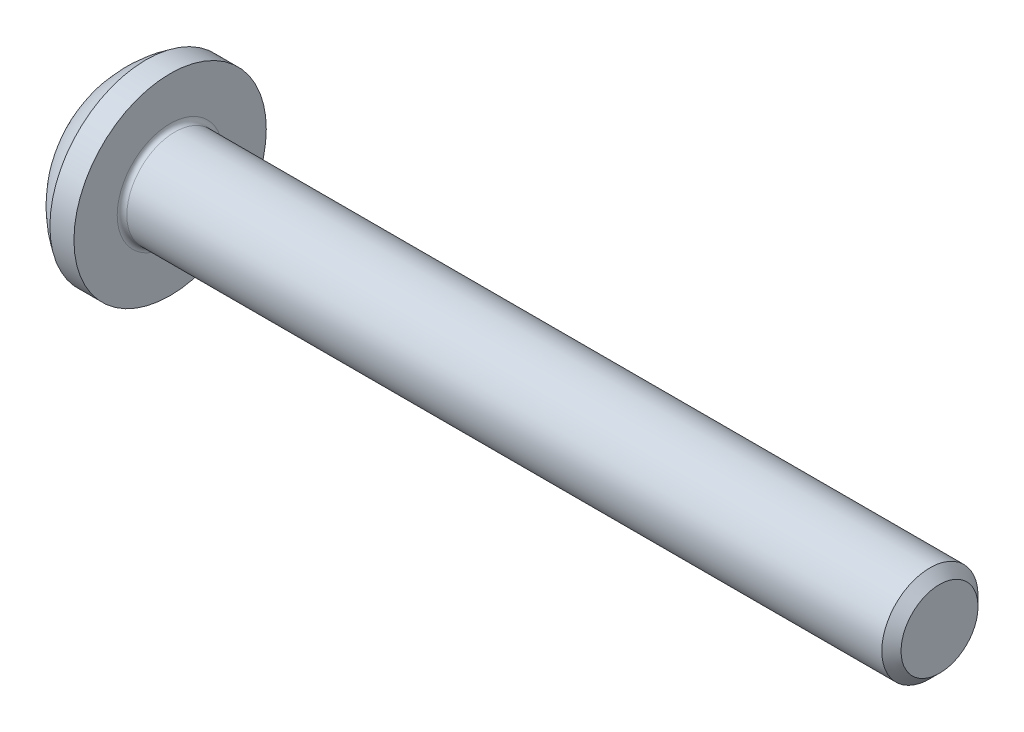
ISO-10303-21;
HEADER;
FILE_DESCRIPTION(('STEP AP214'),'2;1');
FILE_NAME('part.step','',(''),(''),'','','');
FILE_SCHEMA(('AUTOMOTIVE_DESIGN { 1 0 10303 214 1 1 1 1 }'));
ENDSEC;
DATA;
#1=APPLICATION_CONTEXT('core data for automotive mechanical design processes');
#2=APPLICATION_PROTOCOL_DEFINITION('international standard','automotive_design',2000,#1);
#3=PRODUCT_CONTEXT('',#1,'mechanical');
#4=PRODUCT('Part','Part','',(#3));
#5=PRODUCT_RELATED_PRODUCT_CATEGORY('part','',(#4));
#6=PRODUCT_DEFINITION_FORMATION('','',#4);
#7=PRODUCT_DEFINITION_CONTEXT('part definition',#1,'design');
#8=PRODUCT_DEFINITION('design','',#6,#7);
#9=PRODUCT_DEFINITION_SHAPE('','',#8);
#10=(LENGTH_UNIT() NAMED_UNIT(*) SI_UNIT(.MILLI.,.METRE.));
#11=(NAMED_UNIT(*) PLANE_ANGLE_UNIT() SI_UNIT($,.RADIAN.));
#12=(NAMED_UNIT(*) SI_UNIT($,.STERADIAN.) SOLID_ANGLE_UNIT());
#13=UNCERTAINTY_MEASURE_WITH_UNIT(LENGTH_MEASURE(1.E-05),#10,'distance_accuracy_value','');
#14=(GEOMETRIC_REPRESENTATION_CONTEXT(3) GLOBAL_UNCERTAINTY_ASSIGNED_CONTEXT((#13)) GLOBAL_UNIT_ASSIGNED_CONTEXT((#10,
#11,#12)) REPRESENTATION_CONTEXT('',''));
#15=CARTESIAN_POINT('',(0.,0.,0.));
#16=DIRECTION('',(0.,0.,1.));
#17=DIRECTION('',(1.,0.,0.));
#18=AXIS2_PLACEMENT_3D('',#15,#16,#17);
#19=CARTESIAN_POINT('',(1.2,0.,0.));
#20=DIRECTION('',(0.203954254112001,0.,-0.978980419737605));
#21=DIRECTION('',(-0.978980419737605,0.,-0.203954254112001));
#22=AXIS2_PLACEMENT_3D('',#19,#20,#21);
#23=PLANE('',#22);
#24=DIRECTION('',(-0.773791056262993,-0.612584586208203,-0.16120647005479));
#25=VECTOR('',#24,1.);
#26=CARTESIAN_POINT('',(1.2,0.,0.));
#27=LINE('',#26,#25);
#28=CARTESIAN_POINT('',(1.2,0.,0.));
#29=VERTEX_POINT('',#28);
#30=CARTESIAN_POINT('',(0.158727550068813,-0.824340689528857,-0.216931760402331));
#31=VERTEX_POINT('',#30);
#32=EDGE_CURVE('E160',#29,#31,#27,.T.);
#33=ORIENTED_EDGE('',*,*,#32,.F.);
#34=DIRECTION('',(-0.959232920372918,-0.199840191744357,-0.199840191744358));
#35=VECTOR('',#34,1.);
#36=CARTESIAN_POINT('',(1.2,0.,0.));
#37=LINE('',#36,#35);
#38=CARTESIAN_POINT('',(0.0254216507265493,-0.244703822765302,-0.244703822765302));
#39=VERTEX_POINT('',#38);
#40=EDGE_CURVE('E117',#29,#39,#37,.T.);
#41=ORIENTED_EDGE('',*,*,#40,.T.);
#42=CARTESIAN_POINT('',(2.31958856451369,0.,0.233247617607019));
#43=DIRECTION('',(0.203954254112001,0.,-0.978980419737605));
#44=DIRECTION('',(-0.978980419737605,0.,-0.203954254112001));
#45=AXIS2_PLACEMENT_3D('',#42,#43,#44);
#46=CIRCLE('',#45,2.35616624382609);
#47=EDGE_CURVE('E132',#31,#39,#46,.T.);
#48=ORIENTED_EDGE('',*,*,#47,.F.);
#49=EDGE_LOOP('',(#33,#41,#48));
#50=FACE_BOUND('',#49,.T.);
#51=ADVANCED_FACE('F37',(#50),#23,.F.);
#52=CARTESIAN_POINT('',(1.2,0.,0.));
#53=DIRECTION('',(0.203954254112001,0.,0.978980419737605));
#54=DIRECTION('',(0.978980419737605,0.,-0.203954254112001));
#55=AXIS2_PLACEMENT_3D('',#52,#53,#54);
#56=PLANE('',#55);
#57=CARTESIAN_POINT('',(2.31958856451369,0.,-0.233247617607019));
#58=DIRECTION('',(0.203954254112001,0.,0.978980419737605));
#59=DIRECTION('',(0.978980419737605,0.,-0.203954254112001));
#60=AXIS2_PLACEMENT_3D('',#57,#58,#59);
#61=CIRCLE('',#60,2.35616624382609);
#62=CARTESIAN_POINT('',(0.0254216507265493,-0.244703822765303,0.244703822765302));
#63=VERTEX_POINT('',#62);
#64=CARTESIAN_POINT('',(0.158727550068813,-0.824340689528857,0.216931760402331));
#65=VERTEX_POINT('',#64);
#66=EDGE_CURVE('E60',#63,#65,#61,.T.);
#67=ORIENTED_EDGE('',*,*,#66,.F.);
#68=DIRECTION('',(0.959232920372918,0.199840191744359,-0.199840191744358));
#69=VECTOR('',#68,1.);
#70=CARTESIAN_POINT('',(1.2,0.,0.));
#71=LINE('',#70,#69);
#72=EDGE_CURVE('E131',#63,#29,#71,.T.);
#73=ORIENTED_EDGE('',*,*,#72,.T.);
#74=DIRECTION('',(-0.773791056262993,-0.612584586208203,0.16120647005479));
#75=VECTOR('',#74,1.);
#76=CARTESIAN_POINT('',(1.2,0.,0.));
#77=LINE('',#76,#75);
#78=EDGE_CURVE('E161',#29,#65,#77,.T.);
#79=ORIENTED_EDGE('',*,*,#78,.T.);
#80=EDGE_LOOP('',(#67,#73,#79));
#81=FACE_BOUND('',#80,.T.);
#82=ADVANCED_FACE('F176',(#81),#56,.F.);
#83=CARTESIAN_POINT('',(2.36818181818182,0.,0.));
#84=DIRECTION('',(-1.,0.,0.));
#85=DIRECTION('',(0.,1.,0.));
#86=AXIS2_PLACEMENT_3D('',#83,#84,#85);
#87=SPHERICAL_SURFACE('',#86,2.36818181818182);
#88=CARTESIAN_POINT('',(1.9181139031726,0.,-0.568506840011642));
#89=DIRECTION('',(0.620702944365561,0.,0.784045824461761));
#90=DIRECTION('',(0.784045824461761,0.,-0.620702944365561));
#91=AXIS2_PLACEMENT_3D('',#88,#89,#90);
#92=CIRCLE('',#91,2.25444537940181);
#93=CARTESIAN_POINT('',(0.158727550068813,0.216931760402328,0.824340689528857));
#94=VERTEX_POINT('',#93);
#95=CARTESIAN_POINT('',(0.158727550068813,-0.216931760402334,0.824340689528856));
#96=VERTEX_POINT('',#95);
#97=EDGE_CURVE('E123',#94,#96,#92,.T.);
#98=ORIENTED_EDGE('',*,*,#97,.T.);
#99=CARTESIAN_POINT('',(2.31958856451369,0.233247617607019,0.));
#100=DIRECTION('',(0.203954254112001,-0.978980419737605,0.));
#101=DIRECTION('',(0.978980419737605,0.203954254112001,0.));
#102=AXIS2_PLACEMENT_3D('',#99,#100,#101);
#103=CIRCLE('',#102,2.35616624382609);
#104=EDGE_CURVE('E143',#96,#63,#103,.T.);
#105=ORIENTED_EDGE('',*,*,#104,.T.);
#106=ORIENTED_EDGE('',*,*,#66,.T.);
#107=CARTESIAN_POINT('',(1.9181139031726,0.568506840011642,0.));
#108=DIRECTION('',(0.620702944365561,-0.784045824461761,0.));
#109=DIRECTION('',(0.784045824461761,0.620702944365561,0.));
#110=AXIS2_PLACEMENT_3D('',#107,#108,#109);
#111=CIRCLE('',#110,2.25444537940181);
#112=EDGE_CURVE('E173',#65,#31,#111,.T.);
#113=ORIENTED_EDGE('',*,*,#112,.T.);
#114=ORIENTED_EDGE('',*,*,#47,.T.);
#115=CARTESIAN_POINT('',(0.158727550068813,-0.216931760402328,-0.824340689528857));
#116=VERTEX_POINT('',#115);
#117=EDGE_CURVE('E119',#39,#116,#103,.T.);
#118=ORIENTED_EDGE('',*,*,#117,.T.);
#119=CARTESIAN_POINT('',(1.9181139031726,0.,0.568506840011642));
#120=DIRECTION('',(0.620702944365561,0.,-0.784045824461761));
#121=DIRECTION('',(-0.784045824461761,0.,-0.620702944365561));
#122=AXIS2_PLACEMENT_3D('',#119,#120,#121);
#123=CIRCLE('',#122,2.25444537940181);
#124=CARTESIAN_POINT('',(0.158727550068812,0.216931760402334,-0.824340689528856));
#125=VERTEX_POINT('',#124);
#126=EDGE_CURVE('E111',#116,#125,#123,.T.);
#127=ORIENTED_EDGE('',*,*,#126,.T.);
#128=CARTESIAN_POINT('',(2.31958856451369,-0.233247617607019,0.));
#129=DIRECTION('',(0.203954254112001,0.978980419737605,0.));
#130=DIRECTION('',(-0.978980419737605,0.203954254112001,0.));
#131=AXIS2_PLACEMENT_3D('',#128,#129,#130);
#132=CIRCLE('',#131,2.35616624382609);
#133=CARTESIAN_POINT('',(0.0254216507265493,0.244703822765303,-0.244703822765302));
#134=VERTEX_POINT('',#133);
#135=EDGE_CURVE('E102',#125,#134,#132,.T.);
#136=ORIENTED_EDGE('',*,*,#135,.T.);
#137=CARTESIAN_POINT('',(0.158727550068813,0.824340689528857,-0.216931760402331));
#138=VERTEX_POINT('',#137);
#139=EDGE_CURVE('E151',#134,#138,#46,.T.);
#140=ORIENTED_EDGE('',*,*,#139,.T.);
#141=CARTESIAN_POINT('',(1.9181139031726,-0.568506840011642,0.));
#142=DIRECTION('',(0.620702944365561,0.784045824461761,0.));
#143=DIRECTION('',(-0.784045824461761,0.620702944365561,0.));
#144=AXIS2_PLACEMENT_3D('',#141,#142,#143);
#145=CIRCLE('',#144,2.25444537940181);
#146=CARTESIAN_POINT('',(0.158727550068813,0.824340689528857,0.216931760402331));
#147=VERTEX_POINT('',#146);
#148=EDGE_CURVE('E164',#138,#147,#145,.T.);
#149=ORIENTED_EDGE('',*,*,#148,.T.);
#150=CARTESIAN_POINT('',(0.0254216507265493,0.244703822765301,0.244703822765302));
#151=VERTEX_POINT('',#150);
#152=EDGE_CURVE('E156',#147,#151,#61,.T.);
#153=ORIENTED_EDGE('',*,*,#152,.T.);
#154=EDGE_CURVE('E52',#151,#94,#132,.T.);
#155=ORIENTED_EDGE('',*,*,#154,.T.);
#156=EDGE_LOOP('',(#98,#105,#106,#113,#114,#118,#127,#136,#140,#149,#153,#155));
#157=FACE_BOUND('',#156,.T.);
#158=CARTESIAN_POINT('',(1.1,0.,0.));
#159=DIRECTION('',(-1.,0.,0.));
#160=DIRECTION('',(0.,0.,1.));
#161=AXIS2_PLACEMENT_3D('',#158,#159,#160);
#162=CIRCLE('',#161,2.);
#163=CARTESIAN_POINT('',(1.1,0.,2.));
#164=VERTEX_POINT('',#163);
#165=EDGE_CURVE('E184',#164,#164,#162,.T.);
#166=ORIENTED_EDGE('',*,*,#165,.T.);
#167=EDGE_LOOP('',(#166));
#168=FACE_BOUND('',#167,.T.);
#169=ADVANCED_FACE('F198',(#157,#168),#87,.T.);
#170=CARTESIAN_POINT('',(-1.33175770411172,0.,0.));
#171=DIRECTION('',(-1.,0.,0.));
#172=DIRECTION('',(0.,0.,1.));
#173=AXIS2_PLACEMENT_3D('',#170,#171,#172);
#174=CYLINDRICAL_SURFACE('',#173,2.);
#175=ORIENTED_EDGE('',*,*,#165,.F.);
#176=EDGE_LOOP('',(#175));
#177=FACE_BOUND('',#176,.T.);
#178=CARTESIAN_POINT('',(1.6,0.,0.));
#179=DIRECTION('',(-1.,0.,0.));
#180=DIRECTION('',(0.,0.,1.));
#181=AXIS2_PLACEMENT_3D('',#178,#179,#180);
#182=CIRCLE('',#181,2.);
#183=CARTESIAN_POINT('',(1.6,0.,2.));
#184=VERTEX_POINT('',#183);
#185=EDGE_CURVE('E187',#184,#184,#182,.T.);
#186=ORIENTED_EDGE('',*,*,#185,.T.);
#187=EDGE_LOOP('',(#186));
#188=FACE_BOUND('',#187,.T.);
#189=ADVANCED_FACE('F201',(#177,#188),#174,.T.);
#190=CARTESIAN_POINT('',(1.6,1.1,0.));
#191=DIRECTION('',(-1.,0.,0.));
#192=DIRECTION('',(0.,0.,1.));
#193=AXIS2_PLACEMENT_3D('',#190,#191,#192);
#194=PLANE('',#193);
#195=ORIENTED_EDGE('',*,*,#185,.F.);
#196=EDGE_LOOP('',(#195));
#197=FACE_BOUND('',#196,.T.);
#198=CARTESIAN_POINT('',(1.6,0.,0.));
#199=DIRECTION('',(-1.,0.,0.));
#200=DIRECTION('',(0.,0.,1.));
#201=AXIS2_PLACEMENT_3D('',#198,#199,#200);
#202=CIRCLE('',#201,1.1);
#203=CARTESIAN_POINT('',(1.6,0.,1.1));
#204=VERTEX_POINT('',#203);
#205=EDGE_CURVE('E190',#204,#204,#202,.T.);
#206=ORIENTED_EDGE('',*,*,#205,.T.);
#207=EDGE_LOOP('',(#206));
#208=FACE_BOUND('',#207,.T.);
#209=ADVANCED_FACE('F206',(#197,#208),#194,.F.);
#210=CARTESIAN_POINT('',(1.7,0.,0.));
#211=DIRECTION('',(-1.,0.,0.));
#212=DIRECTION('',(0.,0.,1.));
#213=AXIS2_PLACEMENT_3D('',#210,#211,#212);
#214=TOROIDAL_SURFACE('',#213,1.1,0.1);
#215=ORIENTED_EDGE('',*,*,#205,.F.);
#216=EDGE_LOOP('',(#215));
#217=FACE_BOUND('',#216,.T.);
#218=CARTESIAN_POINT('',(1.7,0.,0.));
#219=DIRECTION('',(-1.,0.,0.));
#220=DIRECTION('',(0.,0.,1.));
#221=AXIS2_PLACEMENT_3D('',#218,#219,#220);
#222=CIRCLE('',#221,0.999999999999999);
#223=CARTESIAN_POINT('',(1.7,0.,0.999999999999999));
#224=VERTEX_POINT('',#223);
#225=EDGE_CURVE('E165',#224,#224,#222,.T.);
#226=ORIENTED_EDGE('',*,*,#225,.T.);
#227=EDGE_LOOP('',(#226));
#228=FACE_BOUND('',#227,.T.);
#229=ADVANCED_FACE('F212',(#217,#228),#214,.F.);
#230=CARTESIAN_POINT('',(-1.33175770411172,0.,0.));
#231=DIRECTION('',(-1.,0.,0.));
#232=DIRECTION('',(0.,0.,1.));
#233=AXIS2_PLACEMENT_3D('',#230,#231,#232);
#234=CYLINDRICAL_SURFACE('',#233,1.);
#235=CARTESIAN_POINT('',(17.4,0.,0.));
#236=DIRECTION('',(-1.,0.,0.));
#237=DIRECTION('',(0.,0.,1.));
#238=AXIS2_PLACEMENT_3D('',#235,#236,#237);
#239=CIRCLE('',#238,1.);
#240=CARTESIAN_POINT('',(17.4,0.,1.));
#241=VERTEX_POINT('',#240);
#242=EDGE_CURVE('E45',#241,#241,#239,.T.);
#243=ORIENTED_EDGE('',*,*,#242,.T.);
#244=EDGE_LOOP('',(#243));
#245=FACE_BOUND('',#244,.T.);
#246=ORIENTED_EDGE('',*,*,#225,.F.);
#247=EDGE_LOOP('',(#246));
#248=FACE_BOUND('',#247,.T.);
#249=ADVANCED_FACE('F218',(#245,#248),#234,.T.);
#250=CARTESIAN_POINT('',(17.6,0.,0.));
#251=DIRECTION('',(-1.,0.,0.));
#252=DIRECTION('',(0.,0.,1.));
#253=AXIS2_PLACEMENT_3D('',#250,#251,#252);
#254=PLANE('',#253);
#255=CARTESIAN_POINT('',(17.6,0.,0.));
#256=DIRECTION('',(-1.,0.,0.));
#257=DIRECTION('',(0.,0.,1.));
#258=AXIS2_PLACEMENT_3D('',#255,#256,#257);
#259=CIRCLE('',#258,0.799999999999999);
#260=CARTESIAN_POINT('',(17.6,0.,0.799999999999999));
#261=VERTEX_POINT('',#260);
#262=EDGE_CURVE('E11',#261,#261,#259,.F.);
#263=ORIENTED_EDGE('',*,*,#262,.T.);
#264=EDGE_LOOP('',(#263));
#265=FACE_BOUND('',#264,.T.);
#266=ADVANCED_FACE('F223',(#265),#254,.F.);
#267=ORIENTED_EDGE('',*,*,#139,.F.);
#268=DIRECTION('',(0.959232920372918,-0.199840191744359,0.199840191744358));
#269=VECTOR('',#268,1.);
#270=CARTESIAN_POINT('',(1.2,0.,0.));
#271=LINE('',#270,#269);
#272=EDGE_CURVE('E100',#134,#29,#271,.T.);
#273=ORIENTED_EDGE('',*,*,#272,.T.);
#274=DIRECTION('',(-0.773791056262993,0.612584586208203,-0.16120647005479));
#275=VECTOR('',#274,1.);
#276=CARTESIAN_POINT('',(1.2,0.,0.));
#277=LINE('',#276,#275);
#278=EDGE_CURVE('E150',#29,#138,#277,.T.);
#279=ORIENTED_EDGE('',*,*,#278,.T.);
#280=EDGE_LOOP('',(#267,#273,#279));
#281=FACE_BOUND('',#280,.T.);
#282=ADVANCED_FACE('F148',(#281),#23,.F.);
#283=CARTESIAN_POINT('',(0.,0.95,-0.25));
#284=DIRECTION('',(0.620702944365561,0.784045824461761,0.));
#285=DIRECTION('',(-0.784045824461761,0.620702944365561,0.));
#286=AXIS2_PLACEMENT_3D('',#283,#284,#285);
#287=PLANE('',#286);
#288=ORIENTED_EDGE('',*,*,#278,.F.);
#289=DIRECTION('',(-0.773791056262993,0.612584586208203,0.16120647005479));
#290=VECTOR('',#289,1.);
#291=CARTESIAN_POINT('',(1.2,0.,0.));
#292=LINE('',#291,#290);
#293=EDGE_CURVE('E154',#29,#147,#292,.T.);
#294=ORIENTED_EDGE('',*,*,#293,.T.);
#295=ORIENTED_EDGE('',*,*,#148,.F.);
#296=EDGE_LOOP('',(#288,#294,#295));
#297=FACE_BOUND('',#296,.T.);
#298=ADVANCED_FACE('F163',(#297),#287,.F.);
#299=CARTESIAN_POINT('',(0.,-0.95,0.25));
#300=DIRECTION('',(0.620702944365561,-0.784045824461761,0.));
#301=DIRECTION('',(0.784045824461761,0.620702944365561,0.));
#302=AXIS2_PLACEMENT_3D('',#299,#300,#301);
#303=PLANE('',#302);
#304=ORIENTED_EDGE('',*,*,#78,.F.);
#305=ORIENTED_EDGE('',*,*,#32,.T.);
#306=ORIENTED_EDGE('',*,*,#112,.F.);
#307=EDGE_LOOP('',(#304,#305,#306));
#308=FACE_BOUND('',#307,.T.);
#309=ADVANCED_FACE('F172',(#308),#303,.F.);
#310=ORIENTED_EDGE('',*,*,#293,.F.);
#311=DIRECTION('',(-0.959232920372918,0.199840191744357,0.199840191744358));
#312=VECTOR('',#311,1.);
#313=CARTESIAN_POINT('',(1.2,0.,0.));
#314=LINE('',#313,#312);
#315=EDGE_CURVE('E125',#29,#151,#314,.T.);
#316=ORIENTED_EDGE('',*,*,#315,.T.);
#317=ORIENTED_EDGE('',*,*,#152,.F.);
#318=EDGE_LOOP('',(#310,#316,#317));
#319=FACE_BOUND('',#318,.T.);
#320=ADVANCED_FACE('F155',(#319),#56,.F.);
#321=CARTESIAN_POINT('',(1.2,0.,0.));
#322=DIRECTION('',(0.203954254112001,-0.978980419737605,0.));
#323=DIRECTION('',(-0.978980419737605,-0.203954254112001,0.));
#324=AXIS2_PLACEMENT_3D('',#321,#322,#323);
#325=PLANE('',#324);
#326=DIRECTION('',(-0.773791056262993,-0.161206470054793,0.612584586208202));
#327=VECTOR('',#326,1.);
#328=CARTESIAN_POINT('',(1.2,0.,0.));
#329=LINE('',#328,#327);
#330=EDGE_CURVE('E114',#29,#96,#329,.T.);
#331=ORIENTED_EDGE('',*,*,#330,.F.);
#332=ORIENTED_EDGE('',*,*,#72,.F.);
#333=ORIENTED_EDGE('',*,*,#104,.F.);
#334=EDGE_LOOP('',(#331,#332,#333));
#335=FACE_BOUND('',#334,.T.);
#336=ADVANCED_FACE('F141',(#335),#325,.F.);
#337=CARTESIAN_POINT('',(1.2,0.,0.));
#338=DIRECTION('',(0.203954254112001,0.978980419737605,0.));
#339=DIRECTION('',(0.978980419737605,-0.203954254112001,0.));
#340=AXIS2_PLACEMENT_3D('',#337,#338,#339);
#341=PLANE('',#340);
#342=ORIENTED_EDGE('',*,*,#315,.F.);
#343=DIRECTION('',(-0.773791056262993,0.161206470054788,0.612584586208203));
#344=VECTOR('',#343,1.);
#345=CARTESIAN_POINT('',(1.2,0.,0.));
#346=LINE('',#345,#344);
#347=EDGE_CURVE('E105',#29,#94,#346,.T.);
#348=ORIENTED_EDGE('',*,*,#347,.T.);
#349=ORIENTED_EDGE('',*,*,#154,.F.);
#350=EDGE_LOOP('',(#342,#348,#349));
#351=FACE_BOUND('',#350,.T.);
#352=ADVANCED_FACE('F127',(#351),#341,.F.);
#353=CARTESIAN_POINT('',(0.,-0.250000000000004,0.949999999999999));
#354=DIRECTION('',(0.620702944365561,0.,0.784045824461761));
#355=DIRECTION('',(-0.784045824461761,0.,0.620702944365561));
#356=AXIS2_PLACEMENT_3D('',#353,#354,#355);
#357=PLANE('',#356);
#358=ORIENTED_EDGE('',*,*,#347,.F.);
#359=ORIENTED_EDGE('',*,*,#330,.T.);
#360=ORIENTED_EDGE('',*,*,#97,.F.);
#361=EDGE_LOOP('',(#358,#359,#360));
#362=FACE_BOUND('',#361,.T.);
#363=ADVANCED_FACE('F137',(#362),#357,.F.);
#364=ORIENTED_EDGE('',*,*,#40,.F.);
#365=DIRECTION('',(-0.773791056262993,-0.161206470054788,-0.612584586208203));
#366=VECTOR('',#365,1.);
#367=CARTESIAN_POINT('',(1.2,0.,0.));
#368=LINE('',#367,#366);
#369=EDGE_CURVE('E108',#29,#116,#368,.T.);
#370=ORIENTED_EDGE('',*,*,#369,.T.);
#371=ORIENTED_EDGE('',*,*,#117,.F.);
#372=EDGE_LOOP('',(#364,#370,#371));
#373=FACE_BOUND('',#372,.T.);
#374=ADVANCED_FACE('F118',(#373),#325,.F.);
#375=CARTESIAN_POINT('',(0.,0.250000000000004,-0.949999999999999));
#376=DIRECTION('',(0.620702944365561,0.,-0.784045824461761));
#377=DIRECTION('',(0.784045824461761,0.,0.620702944365561));
#378=AXIS2_PLACEMENT_3D('',#375,#376,#377);
#379=PLANE('',#378);
#380=ORIENTED_EDGE('',*,*,#369,.F.);
#381=DIRECTION('',(-0.773791056262993,0.161206470054793,-0.612584586208202));
#382=VECTOR('',#381,1.);
#383=CARTESIAN_POINT('',(1.2,0.,0.));
#384=LINE('',#383,#382);
#385=EDGE_CURVE('E96',#29,#125,#384,.T.);
#386=ORIENTED_EDGE('',*,*,#385,.T.);
#387=ORIENTED_EDGE('',*,*,#126,.F.);
#388=EDGE_LOOP('',(#380,#386,#387));
#389=FACE_BOUND('',#388,.T.);
#390=ADVANCED_FACE('F110',(#389),#379,.F.);
#391=ORIENTED_EDGE('',*,*,#385,.F.);
#392=ORIENTED_EDGE('',*,*,#272,.F.);
#393=ORIENTED_EDGE('',*,*,#135,.F.);
#394=EDGE_LOOP('',(#391,#392,#393));
#395=FACE_BOUND('',#394,.T.);
#396=ADVANCED_FACE('F98',(#395),#341,.F.);
#397=CARTESIAN_POINT('',(17.4,0.,0.));
#398=DIRECTION('',(-1.,0.,0.));
#399=DIRECTION('',(0.,0.,1.));
#400=AXIS2_PLACEMENT_3D('',#397,#398,#399);
#401=CONICAL_SURFACE('',#400,1.,0.785398163397445);
#402=ORIENTED_EDGE('',*,*,#262,.F.);
#403=EDGE_LOOP('',(#402));
#404=FACE_BOUND('',#403,.T.);
#405=ORIENTED_EDGE('',*,*,#242,.F.);
#406=EDGE_LOOP('',(#405));
#407=FACE_BOUND('',#406,.T.);
#408=ADVANCED_FACE('F39',(#404,#407),#401,.T.);
#409=CLOSED_SHELL('',(#51,#82,#169,#189,#209,#229,#249,#266,#282,#298,#309,#320,#336,#352,#363,
#374,#390,#396,#408));
#410=MANIFOLD_SOLID_BREP('B2',#409);
#411=ADVANCED_BREP_SHAPE_REPRESENTATION('',(#18,#410),#14);
#412=SHAPE_DEFINITION_REPRESENTATION(#9,#411);
ENDSEC;
END-ISO-10303-21;
